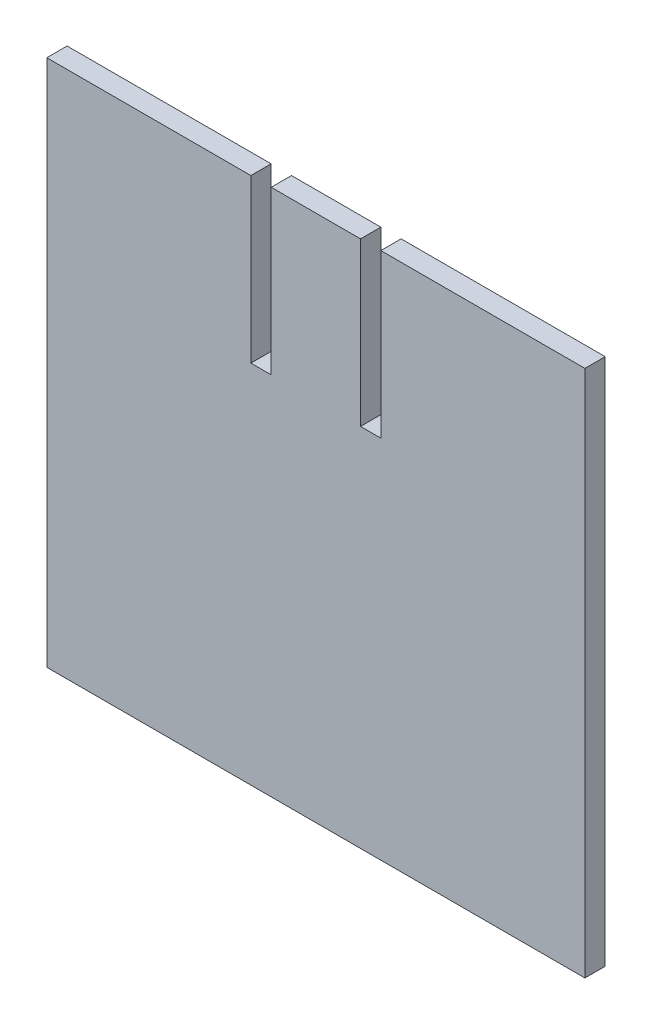
ISO-10303-21;
HEADER;
FILE_DESCRIPTION(('STEP AP214'),'2;1');
FILE_NAME('part.step','',(''),(''),'','','');
FILE_SCHEMA(('AUTOMOTIVE_DESIGN { 1 0 10303 214 1 1 1 1 }'));
ENDSEC;
DATA;
#1=APPLICATION_CONTEXT('core data for automotive mechanical design processes');
#2=APPLICATION_PROTOCOL_DEFINITION('international standard','automotive_design',2000,#1);
#3=PRODUCT_CONTEXT('',#1,'mechanical');
#4=PRODUCT('Part','Part','',(#3));
#5=PRODUCT_RELATED_PRODUCT_CATEGORY('part','',(#4));
#6=PRODUCT_DEFINITION_FORMATION('','',#4);
#7=PRODUCT_DEFINITION_CONTEXT('part definition',#1,'design');
#8=PRODUCT_DEFINITION('design','',#6,#7);
#9=PRODUCT_DEFINITION_SHAPE('','',#8);
#10=(LENGTH_UNIT() NAMED_UNIT(*) SI_UNIT(.MILLI.,.METRE.));
#11=(NAMED_UNIT(*) PLANE_ANGLE_UNIT() SI_UNIT($,.RADIAN.));
#12=(NAMED_UNIT(*) SI_UNIT($,.STERADIAN.) SOLID_ANGLE_UNIT());
#13=UNCERTAINTY_MEASURE_WITH_UNIT(LENGTH_MEASURE(1.E-05),#10,'distance_accuracy_value','');
#14=(GEOMETRIC_REPRESENTATION_CONTEXT(3) GLOBAL_UNCERTAINTY_ASSIGNED_CONTEXT((#13)) GLOBAL_UNIT_ASSIGNED_CONTEXT((#10,
#11,#12)) REPRESENTATION_CONTEXT('',''));
#15=CARTESIAN_POINT('',(0.,0.,0.));
#16=DIRECTION('',(0.,0.,1.));
#17=DIRECTION('',(1.,0.,0.));
#18=AXIS2_PLACEMENT_3D('',#15,#16,#17);
#19=CARTESIAN_POINT('',(0.,0.,6.35));
#20=DIRECTION('',(0.,-1.,0.));
#21=DIRECTION('',(1.,0.,0.));
#22=AXIS2_PLACEMENT_3D('',#19,#20,#21);
#23=PLANE('',#22);
#24=DIRECTION('',(-1.,0.,0.));
#25=VECTOR('',#24,1.);
#26=CARTESIAN_POINT('',(0.,0.,0.));
#27=LINE('',#26,#25);
#28=CARTESIAN_POINT('',(168.275,0.,0.));
#29=VERTEX_POINT('',#28);
#30=CARTESIAN_POINT('',(0.,0.,0.));
#31=VERTEX_POINT('',#30);
#32=EDGE_CURVE('E153',#29,#31,#27,.T.);
#33=ORIENTED_EDGE('',*,*,#32,.F.);
#34=DIRECTION('',(0.,0.,-1.));
#35=VECTOR('',#34,1.);
#36=CARTESIAN_POINT('',(168.275,0.,6.35));
#37=LINE('',#36,#35);
#38=CARTESIAN_POINT('',(168.275,0.,6.35));
#39=VERTEX_POINT('',#38);
#40=EDGE_CURVE('E11',#39,#29,#37,.T.);
#41=ORIENTED_EDGE('',*,*,#40,.F.);
#42=DIRECTION('',(-1.,0.,0.));
#43=VECTOR('',#42,1.);
#44=CARTESIAN_POINT('',(0.,0.,6.35));
#45=LINE('',#44,#43);
#46=CARTESIAN_POINT('',(0.,0.,6.35));
#47=VERTEX_POINT('',#46);
#48=EDGE_CURVE('E181',#39,#47,#45,.T.);
#49=ORIENTED_EDGE('',*,*,#48,.T.);
#50=DIRECTION('',(0.,0.,-1.));
#51=VECTOR('',#50,1.);
#52=CARTESIAN_POINT('',(0.,0.,6.35));
#53=LINE('',#52,#51);
#54=EDGE_CURVE('E51',#47,#31,#53,.T.);
#55=ORIENTED_EDGE('',*,*,#54,.T.);
#56=EDGE_LOOP('',(#33,#41,#49,#55));
#57=FACE_BOUND('',#56,.T.);
#58=ADVANCED_FACE('F35',(#57),#23,.T.);
#59=CARTESIAN_POINT('',(168.275,0.,6.35));
#60=DIRECTION('',(-1.,0.,0.));
#61=DIRECTION('',(0.,-1.,0.));
#62=AXIS2_PLACEMENT_3D('',#59,#60,#61);
#63=PLANE('',#62);
#64=DIRECTION('',(0.,1.,0.));
#65=VECTOR('',#64,1.);
#66=CARTESIAN_POINT('',(168.275,0.,0.));
#67=LINE('',#66,#65);
#68=CARTESIAN_POINT('',(168.275,165.1,0.));
#69=VERTEX_POINT('',#68);
#70=EDGE_CURVE('E155',#29,#69,#67,.T.);
#71=ORIENTED_EDGE('',*,*,#70,.T.);
#72=DIRECTION('',(0.,0.,-1.));
#73=VECTOR('',#72,1.);
#74=CARTESIAN_POINT('',(168.275,165.1,6.35));
#75=LINE('',#74,#73);
#76=CARTESIAN_POINT('',(168.275,165.1,6.35));
#77=VERTEX_POINT('',#76);
#78=EDGE_CURVE('E43',#77,#69,#75,.T.);
#79=ORIENTED_EDGE('',*,*,#78,.F.);
#80=DIRECTION('',(0.,1.,0.));
#81=VECTOR('',#80,1.);
#82=CARTESIAN_POINT('',(168.275,0.,6.35));
#83=LINE('',#82,#81);
#84=EDGE_CURVE('E367',#39,#77,#83,.T.);
#85=ORIENTED_EDGE('',*,*,#84,.F.);
#86=ORIENTED_EDGE('',*,*,#40,.T.);
#87=EDGE_LOOP('',(#71,#79,#85,#86));
#88=FACE_BOUND('',#87,.T.);
#89=ADVANCED_FACE('F251',(#88),#63,.F.);
#90=CARTESIAN_POINT('',(0.,165.1,6.35));
#91=DIRECTION('',(0.,-1.,0.));
#92=DIRECTION('',(0.,0.,-1.));
#93=AXIS2_PLACEMENT_3D('',#90,#91,#92);
#94=PLANE('',#93);
#95=DIRECTION('',(-1.,0.,0.));
#96=VECTOR('',#95,1.);
#97=CARTESIAN_POINT('',(0.,165.1,0.));
#98=LINE('',#97,#96);
#99=CARTESIAN_POINT('',(104.4575,165.1,0.));
#100=VERTEX_POINT('',#99);
#101=EDGE_CURVE('E157',#69,#100,#98,.T.);
#102=ORIENTED_EDGE('',*,*,#101,.T.);
#103=DIRECTION('',(0.,0.,-1.));
#104=VECTOR('',#103,1.);
#105=CARTESIAN_POINT('',(104.4575,165.1,6.35));
#106=LINE('',#105,#104);
#107=CARTESIAN_POINT('',(104.4575,165.1,6.35));
#108=VERTEX_POINT('',#107);
#109=EDGE_CURVE('E197',#108,#100,#106,.T.);
#110=ORIENTED_EDGE('',*,*,#109,.F.);
#111=DIRECTION('',(-1.,0.,0.));
#112=VECTOR('',#111,1.);
#113=CARTESIAN_POINT('',(0.,165.1,6.35));
#114=LINE('',#113,#112);
#115=EDGE_CURVE('E206',#77,#108,#114,.T.);
#116=ORIENTED_EDGE('',*,*,#115,.F.);
#117=ORIENTED_EDGE('',*,*,#78,.T.);
#118=EDGE_LOOP('',(#102,#110,#116,#117));
#119=FACE_BOUND('',#118,.T.);
#120=ADVANCED_FACE('F204',(#119),#94,.F.);
#121=CARTESIAN_POINT('',(104.4575,0.,6.35));
#122=DIRECTION('',(1.,0.,0.));
#123=DIRECTION('',(0.,1.,0.));
#124=AXIS2_PLACEMENT_3D('',#121,#122,#123);
#125=PLANE('',#124);
#126=DIRECTION('',(0.,-1.,0.));
#127=VECTOR('',#126,1.);
#128=CARTESIAN_POINT('',(104.4575,0.,0.));
#129=LINE('',#128,#127);
#130=CARTESIAN_POINT('',(104.4575,114.3,0.));
#131=VERTEX_POINT('',#130);
#132=EDGE_CURVE('E159',#100,#131,#129,.T.);
#133=ORIENTED_EDGE('',*,*,#132,.T.);
#134=DIRECTION('',(0.,0.,-1.));
#135=VECTOR('',#134,1.);
#136=CARTESIAN_POINT('',(104.4575,114.3,6.35));
#137=LINE('',#136,#135);
#138=CARTESIAN_POINT('',(104.4575,114.3,6.35));
#139=VERTEX_POINT('',#138);
#140=EDGE_CURVE('E194',#139,#131,#137,.T.);
#141=ORIENTED_EDGE('',*,*,#140,.F.);
#142=DIRECTION('',(0.,-1.,0.));
#143=VECTOR('',#142,1.);
#144=CARTESIAN_POINT('',(104.4575,0.,6.35));
#145=LINE('',#144,#143);
#146=EDGE_CURVE('E225',#108,#139,#145,.T.);
#147=ORIENTED_EDGE('',*,*,#146,.F.);
#148=ORIENTED_EDGE('',*,*,#109,.T.);
#149=EDGE_LOOP('',(#133,#141,#147,#148));
#150=FACE_BOUND('',#149,.T.);
#151=ADVANCED_FACE('F216',(#150),#125,.F.);
#152=CARTESIAN_POINT('',(0.,114.3,6.35));
#153=DIRECTION('',(0.,-1.,0.));
#154=DIRECTION('',(0.,0.,-1.));
#155=AXIS2_PLACEMENT_3D('',#152,#153,#154);
#156=PLANE('',#155);
#157=DIRECTION('',(-1.,0.,0.));
#158=VECTOR('',#157,1.);
#159=CARTESIAN_POINT('',(0.,114.3,0.));
#160=LINE('',#159,#158);
#161=CARTESIAN_POINT('',(98.1075,114.3,0.));
#162=VERTEX_POINT('',#161);
#163=EDGE_CURVE('E161',#131,#162,#160,.T.);
#164=ORIENTED_EDGE('',*,*,#163,.T.);
#165=DIRECTION('',(0.,0.,-1.));
#166=VECTOR('',#165,1.);
#167=CARTESIAN_POINT('',(98.1075,114.3,6.35));
#168=LINE('',#167,#166);
#169=CARTESIAN_POINT('',(98.1075,114.3,6.35));
#170=VERTEX_POINT('',#169);
#171=EDGE_CURVE('E191',#170,#162,#168,.T.);
#172=ORIENTED_EDGE('',*,*,#171,.F.);
#173=DIRECTION('',(-1.,0.,0.));
#174=VECTOR('',#173,1.);
#175=CARTESIAN_POINT('',(0.,114.3,6.35));
#176=LINE('',#175,#174);
#177=EDGE_CURVE('E222',#139,#170,#176,.T.);
#178=ORIENTED_EDGE('',*,*,#177,.F.);
#179=ORIENTED_EDGE('',*,*,#140,.T.);
#180=EDGE_LOOP('',(#164,#172,#178,#179));
#181=FACE_BOUND('',#180,.T.);
#182=ADVANCED_FACE('F220',(#181),#156,.F.);
#183=CARTESIAN_POINT('',(98.1075,0.,6.35));
#184=DIRECTION('',(-1.,0.,0.));
#185=DIRECTION('',(0.,-1.,0.));
#186=AXIS2_PLACEMENT_3D('',#183,#184,#185);
#187=PLANE('',#186);
#188=DIRECTION('',(0.,1.,0.));
#189=VECTOR('',#188,1.);
#190=CARTESIAN_POINT('',(98.1075,0.,0.));
#191=LINE('',#190,#189);
#192=CARTESIAN_POINT('',(98.1075,165.1,0.));
#193=VERTEX_POINT('',#192);
#194=EDGE_CURVE('E163',#162,#193,#191,.T.);
#195=ORIENTED_EDGE('',*,*,#194,.T.);
#196=DIRECTION('',(0.,0.,-1.));
#197=VECTOR('',#196,1.);
#198=CARTESIAN_POINT('',(98.1075,165.1,6.35));
#199=LINE('',#198,#197);
#200=CARTESIAN_POINT('',(98.1075,165.1,6.35));
#201=VERTEX_POINT('',#200);
#202=EDGE_CURVE('E189',#201,#193,#199,.T.);
#203=ORIENTED_EDGE('',*,*,#202,.F.);
#204=DIRECTION('',(0.,1.,0.));
#205=VECTOR('',#204,1.);
#206=CARTESIAN_POINT('',(98.1075,0.,6.35));
#207=LINE('',#206,#205);
#208=EDGE_CURVE('E224',#170,#201,#207,.T.);
#209=ORIENTED_EDGE('',*,*,#208,.F.);
#210=ORIENTED_EDGE('',*,*,#171,.T.);
#211=EDGE_LOOP('',(#195,#203,#209,#210));
#212=FACE_BOUND('',#211,.T.);
#213=ADVANCED_FACE('F264',(#212),#187,.F.);
#214=CARTESIAN_POINT('',(0.,165.1,6.35));
#215=DIRECTION('',(0.,1.,0.));
#216=DIRECTION('',(0.,0.,1.));
#217=AXIS2_PLACEMENT_3D('',#214,#215,#216);
#218=PLANE('',#217);
#219=DIRECTION('',(1.,0.,0.));
#220=VECTOR('',#219,1.);
#221=CARTESIAN_POINT('',(0.,165.1,0.));
#222=LINE('',#221,#220);
#223=CARTESIAN_POINT('',(70.1675,165.1,0.));
#224=VERTEX_POINT('',#223);
#225=EDGE_CURVE('E166',#224,#193,#222,.T.);
#226=ORIENTED_EDGE('',*,*,#225,.F.);
#227=DIRECTION('',(0.,0.,-1.));
#228=VECTOR('',#227,1.);
#229=CARTESIAN_POINT('',(70.1675,165.1,6.35));
#230=LINE('',#229,#228);
#231=CARTESIAN_POINT('',(70.1675,165.1,6.35));
#232=VERTEX_POINT('',#231);
#233=EDGE_CURVE('E187',#232,#224,#230,.T.);
#234=ORIENTED_EDGE('',*,*,#233,.F.);
#235=DIRECTION('',(1.,0.,0.));
#236=VECTOR('',#235,1.);
#237=CARTESIAN_POINT('',(0.,165.1,6.35));
#238=LINE('',#237,#236);
#239=EDGE_CURVE('E227',#232,#201,#238,.T.);
#240=ORIENTED_EDGE('',*,*,#239,.T.);
#241=ORIENTED_EDGE('',*,*,#202,.T.);
#242=EDGE_LOOP('',(#226,#234,#240,#241));
#243=FACE_BOUND('',#242,.T.);
#244=ADVANCED_FACE('F267',(#243),#218,.T.);
#245=CARTESIAN_POINT('',(70.1675,0.,6.35));
#246=DIRECTION('',(-1.,0.,0.));
#247=DIRECTION('',(0.,0.,1.));
#248=AXIS2_PLACEMENT_3D('',#245,#246,#247);
#249=PLANE('',#248);
#250=DIRECTION('',(0.,1.,0.));
#251=VECTOR('',#250,1.);
#252=CARTESIAN_POINT('',(70.1675,0.,0.));
#253=LINE('',#252,#251);
#254=CARTESIAN_POINT('',(70.1675,114.3,0.));
#255=VERTEX_POINT('',#254);
#256=EDGE_CURVE('E169',#255,#224,#253,.T.);
#257=ORIENTED_EDGE('',*,*,#256,.F.);
#258=DIRECTION('',(0.,0.,-1.));
#259=VECTOR('',#258,1.);
#260=CARTESIAN_POINT('',(70.1675,114.3,6.35));
#261=LINE('',#260,#259);
#262=CARTESIAN_POINT('',(70.1675,114.3,6.35));
#263=VERTEX_POINT('',#262);
#264=EDGE_CURVE('E185',#263,#255,#261,.T.);
#265=ORIENTED_EDGE('',*,*,#264,.F.);
#266=DIRECTION('',(0.,1.,0.));
#267=VECTOR('',#266,1.);
#268=CARTESIAN_POINT('',(70.1675,0.,6.35));
#269=LINE('',#268,#267);
#270=EDGE_CURVE('E234',#263,#232,#269,.T.);
#271=ORIENTED_EDGE('',*,*,#270,.T.);
#272=ORIENTED_EDGE('',*,*,#233,.T.);
#273=EDGE_LOOP('',(#257,#265,#271,#272));
#274=FACE_BOUND('',#273,.T.);
#275=ADVANCED_FACE('F271',(#274),#249,.T.);
#276=CARTESIAN_POINT('',(0.,114.3,6.35));
#277=DIRECTION('',(0.,1.,0.));
#278=DIRECTION('',(0.,0.,1.));
#279=AXIS2_PLACEMENT_3D('',#276,#277,#278);
#280=PLANE('',#279);
#281=DIRECTION('',(1.,0.,0.));
#282=VECTOR('',#281,1.);
#283=CARTESIAN_POINT('',(0.,114.3,0.));
#284=LINE('',#283,#282);
#285=CARTESIAN_POINT('',(63.8175,114.3,0.));
#286=VERTEX_POINT('',#285);
#287=EDGE_CURVE('E172',#286,#255,#284,.T.);
#288=ORIENTED_EDGE('',*,*,#287,.F.);
#289=DIRECTION('',(0.,0.,-1.));
#290=VECTOR('',#289,1.);
#291=CARTESIAN_POINT('',(63.8175,114.3,6.35));
#292=LINE('',#291,#290);
#293=CARTESIAN_POINT('',(63.8175,114.3,6.35));
#294=VERTEX_POINT('',#293);
#295=EDGE_CURVE('E134',#294,#286,#292,.T.);
#296=ORIENTED_EDGE('',*,*,#295,.F.);
#297=DIRECTION('',(1.,0.,0.));
#298=VECTOR('',#297,1.);
#299=CARTESIAN_POINT('',(0.,114.3,6.35));
#300=LINE('',#299,#298);
#301=EDGE_CURVE('E145',#294,#263,#300,.T.);
#302=ORIENTED_EDGE('',*,*,#301,.T.);
#303=ORIENTED_EDGE('',*,*,#264,.T.);
#304=EDGE_LOOP('',(#288,#296,#302,#303));
#305=FACE_BOUND('',#304,.T.);
#306=ADVANCED_FACE('F238',(#305),#280,.T.);
#307=CARTESIAN_POINT('',(63.8175,0.,6.35));
#308=DIRECTION('',(1.,0.,0.));
#309=DIRECTION('',(0.,0.,-1.));
#310=AXIS2_PLACEMENT_3D('',#307,#308,#309);
#311=PLANE('',#310);
#312=DIRECTION('',(0.,-1.,0.));
#313=VECTOR('',#312,1.);
#314=CARTESIAN_POINT('',(63.8175,0.,0.));
#315=LINE('',#314,#313);
#316=CARTESIAN_POINT('',(63.8175,165.1,0.));
#317=VERTEX_POINT('',#316);
#318=EDGE_CURVE('E130',#317,#286,#315,.T.);
#319=ORIENTED_EDGE('',*,*,#318,.F.);
#320=DIRECTION('',(0.,0.,-1.));
#321=VECTOR('',#320,1.);
#322=CARTESIAN_POINT('',(63.8175,165.1,6.35));
#323=LINE('',#322,#321);
#324=CARTESIAN_POINT('',(63.8175,165.1,6.35));
#325=VERTEX_POINT('',#324);
#326=EDGE_CURVE('E125',#325,#317,#323,.T.);
#327=ORIENTED_EDGE('',*,*,#326,.F.);
#328=DIRECTION('',(0.,-1.,0.));
#329=VECTOR('',#328,1.);
#330=CARTESIAN_POINT('',(63.8175,0.,6.35));
#331=LINE('',#330,#329);
#332=EDGE_CURVE('E128',#325,#294,#331,.T.);
#333=ORIENTED_EDGE('',*,*,#332,.T.);
#334=ORIENTED_EDGE('',*,*,#295,.T.);
#335=EDGE_LOOP('',(#319,#327,#333,#334));
#336=FACE_BOUND('',#335,.T.);
#337=ADVANCED_FACE('F127',(#336),#311,.T.);
#338=CARTESIAN_POINT('',(0.,165.1,6.35));
#339=DIRECTION('',(0.,1.,0.));
#340=DIRECTION('',(-1.,0.,0.));
#341=AXIS2_PLACEMENT_3D('',#338,#339,#340);
#342=PLANE('',#341);
#343=DIRECTION('',(1.,0.,0.));
#344=VECTOR('',#343,1.);
#345=CARTESIAN_POINT('',(0.,165.1,0.));
#346=LINE('',#345,#344);
#347=CARTESIAN_POINT('',(0.,165.1,0.));
#348=VERTEX_POINT('',#347);
#349=EDGE_CURVE('E176',#348,#317,#346,.T.);
#350=ORIENTED_EDGE('',*,*,#349,.F.);
#351=DIRECTION('',(0.,0.,-1.));
#352=VECTOR('',#351,1.);
#353=CARTESIAN_POINT('',(0.,165.1,6.35));
#354=LINE('',#353,#352);
#355=CARTESIAN_POINT('',(0.,165.1,6.35));
#356=VERTEX_POINT('',#355);
#357=EDGE_CURVE('E88',#356,#348,#354,.T.);
#358=ORIENTED_EDGE('',*,*,#357,.F.);
#359=DIRECTION('',(1.,0.,0.));
#360=VECTOR('',#359,1.);
#361=CARTESIAN_POINT('',(0.,165.1,6.35));
#362=LINE('',#361,#360);
#363=EDGE_CURVE('E142',#356,#325,#362,.T.);
#364=ORIENTED_EDGE('',*,*,#363,.T.);
#365=ORIENTED_EDGE('',*,*,#326,.T.);
#366=EDGE_LOOP('',(#350,#358,#364,#365));
#367=FACE_BOUND('',#366,.T.);
#368=ADVANCED_FACE('F147',(#367),#342,.T.);
#369=CARTESIAN_POINT('',(0.,0.,6.35));
#370=DIRECTION('',(-1.,0.,0.));
#371=DIRECTION('',(0.,0.,1.));
#372=AXIS2_PLACEMENT_3D('',#369,#370,#371);
#373=PLANE('',#372);
#374=DIRECTION('',(0.,1.,0.));
#375=VECTOR('',#374,1.);
#376=CARTESIAN_POINT('',(0.,0.,0.));
#377=LINE('',#376,#375);
#378=EDGE_CURVE('E178',#31,#348,#377,.T.);
#379=ORIENTED_EDGE('',*,*,#378,.F.);
#380=ORIENTED_EDGE('',*,*,#54,.F.);
#381=DIRECTION('',(0.,1.,0.));
#382=VECTOR('',#381,1.);
#383=CARTESIAN_POINT('',(0.,0.,6.35));
#384=LINE('',#383,#382);
#385=EDGE_CURVE('E148',#47,#356,#384,.T.);
#386=ORIENTED_EDGE('',*,*,#385,.T.);
#387=ORIENTED_EDGE('',*,*,#357,.T.);
#388=EDGE_LOOP('',(#379,#380,#386,#387));
#389=FACE_BOUND('',#388,.T.);
#390=ADVANCED_FACE('F240',(#389),#373,.T.);
#391=CARTESIAN_POINT('',(0.,0.,6.35));
#392=DIRECTION('',(0.,0.,1.));
#393=DIRECTION('',(1.,0.,0.));
#394=AXIS2_PLACEMENT_3D('',#391,#392,#393);
#395=PLANE('',#394);
#396=ORIENTED_EDGE('',*,*,#48,.F.);
#397=ORIENTED_EDGE('',*,*,#84,.T.);
#398=ORIENTED_EDGE('',*,*,#115,.T.);
#399=ORIENTED_EDGE('',*,*,#146,.T.);
#400=ORIENTED_EDGE('',*,*,#177,.T.);
#401=ORIENTED_EDGE('',*,*,#208,.T.);
#402=ORIENTED_EDGE('',*,*,#239,.F.);
#403=ORIENTED_EDGE('',*,*,#270,.F.);
#404=ORIENTED_EDGE('',*,*,#301,.F.);
#405=ORIENTED_EDGE('',*,*,#332,.F.);
#406=ORIENTED_EDGE('',*,*,#363,.F.);
#407=ORIENTED_EDGE('',*,*,#385,.F.);
#408=EDGE_LOOP('',(#396,#397,#398,#399,#400,#401,#402,#403,#404,#405,#406,#407));
#409=FACE_BOUND('',#408,.T.);
#410=ADVANCED_FACE('F140',(#409),#395,.T.);
#411=CARTESIAN_POINT('',(0.,0.,0.));
#412=DIRECTION('',(0.,0.,1.));
#413=DIRECTION('',(1.,0.,0.));
#414=AXIS2_PLACEMENT_3D('',#411,#412,#413);
#415=PLANE('',#414);
#416=ORIENTED_EDGE('',*,*,#32,.T.);
#417=ORIENTED_EDGE('',*,*,#378,.T.);
#418=ORIENTED_EDGE('',*,*,#349,.T.);
#419=ORIENTED_EDGE('',*,*,#318,.T.);
#420=ORIENTED_EDGE('',*,*,#287,.T.);
#421=ORIENTED_EDGE('',*,*,#256,.T.);
#422=ORIENTED_EDGE('',*,*,#225,.T.);
#423=ORIENTED_EDGE('',*,*,#194,.F.);
#424=ORIENTED_EDGE('',*,*,#163,.F.);
#425=ORIENTED_EDGE('',*,*,#132,.F.);
#426=ORIENTED_EDGE('',*,*,#101,.F.);
#427=ORIENTED_EDGE('',*,*,#70,.F.);
#428=EDGE_LOOP('',(#416,#417,#418,#419,#420,#421,#422,#423,#424,#425,#426,#427));
#429=FACE_BOUND('',#428,.T.);
#430=ADVANCED_FACE('F211',(#429),#415,.F.);
#431=CLOSED_SHELL('',(#58,#89,#120,#151,#182,#213,#244,#275,#306,#337,#368,#390,#410,#430));
#432=MANIFOLD_SOLID_BREP('B2',#431);
#433=ADVANCED_BREP_SHAPE_REPRESENTATION('',(#18,#432),#14);
#434=SHAPE_DEFINITION_REPRESENTATION(#9,#433);
ENDSEC;
END-ISO-10303-21;
